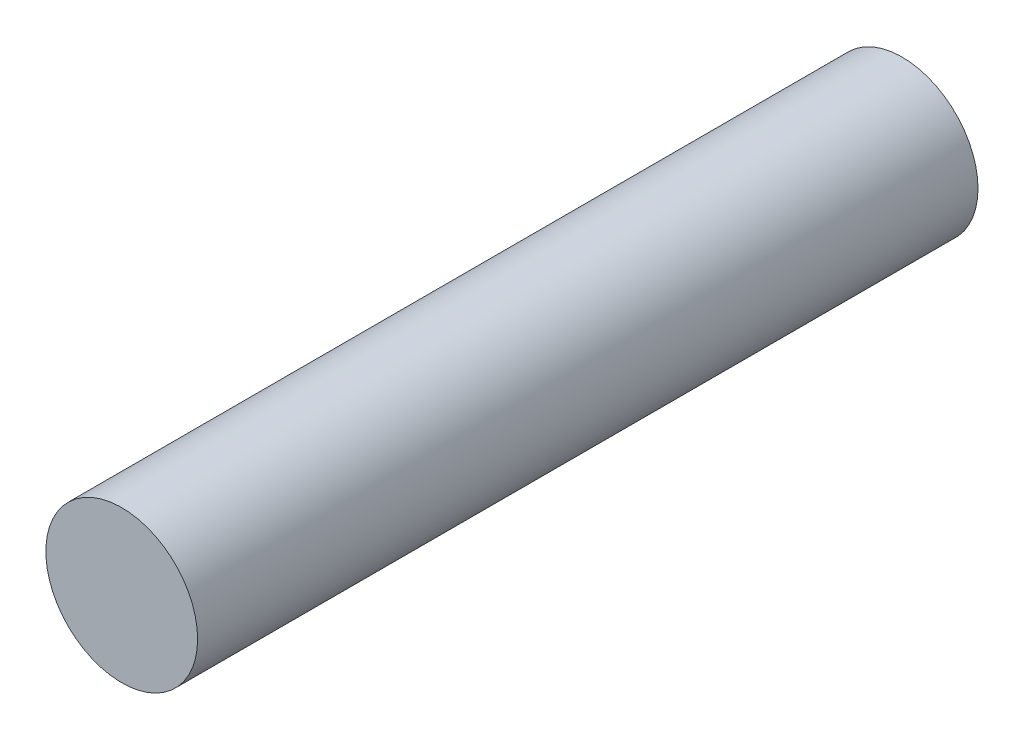
ISO-10303-21;
HEADER;
FILE_DESCRIPTION(('STEP AP214'),'2;1');
FILE_NAME('part.step','',(''),(''),'','','');
FILE_SCHEMA(('AUTOMOTIVE_DESIGN { 1 0 10303 214 1 1 1 1 }'));
ENDSEC;
DATA;
#1=APPLICATION_CONTEXT('core data for automotive mechanical design processes');
#2=APPLICATION_PROTOCOL_DEFINITION('international standard','automotive_design',2000,#1);
#3=PRODUCT_CONTEXT('',#1,'mechanical');
#4=PRODUCT('Part','Part','',(#3));
#5=PRODUCT_RELATED_PRODUCT_CATEGORY('part','',(#4));
#6=PRODUCT_DEFINITION_FORMATION('','',#4);
#7=PRODUCT_DEFINITION_CONTEXT('part definition',#1,'design');
#8=PRODUCT_DEFINITION('design','',#6,#7);
#9=PRODUCT_DEFINITION_SHAPE('','',#8);
#10=(LENGTH_UNIT() NAMED_UNIT(*) SI_UNIT(.MILLI.,.METRE.));
#11=(NAMED_UNIT(*) PLANE_ANGLE_UNIT() SI_UNIT($,.RADIAN.));
#12=(NAMED_UNIT(*) SI_UNIT($,.STERADIAN.) SOLID_ANGLE_UNIT());
#13=UNCERTAINTY_MEASURE_WITH_UNIT(LENGTH_MEASURE(1.E-05),#10,'distance_accuracy_value','');
#14=(GEOMETRIC_REPRESENTATION_CONTEXT(3) GLOBAL_UNCERTAINTY_ASSIGNED_CONTEXT((#13)) GLOBAL_UNIT_ASSIGNED_CONTEXT((#10,
#11,#12)) REPRESENTATION_CONTEXT('',''));
#15=CARTESIAN_POINT('',(0.,0.,0.));
#16=DIRECTION('',(0.,0.,1.));
#17=DIRECTION('',(1.,0.,0.));
#18=AXIS2_PLACEMENT_3D('',#15,#16,#17);
#19=CARTESIAN_POINT('',(0.,0.,18.));
#20=DIRECTION('',(0.,0.,-1.));
#21=DIRECTION('',(-1.,0.,0.));
#22=AXIS2_PLACEMENT_3D('',#19,#20,#21);
#23=CYLINDRICAL_SURFACE('',#22,3.5);
#24=CARTESIAN_POINT('',(0.,0.,18.));
#25=DIRECTION('',(0.,0.,1.));
#26=DIRECTION('',(1.,0.,0.));
#27=AXIS2_PLACEMENT_3D('',#24,#25,#26);
#28=CIRCLE('',#27,3.5);
#29=CARTESIAN_POINT('',(3.5,0.,18.));
#30=VERTEX_POINT('',#29);
#31=EDGE_CURVE('E10',#30,#30,#28,.T.);
#32=ORIENTED_EDGE('',*,*,#31,.F.);
#33=EDGE_LOOP('',(#32));
#34=FACE_BOUND('',#33,.T.);
#35=CARTESIAN_POINT('',(0.,0.,-18.));
#36=DIRECTION('',(0.,0.,1.));
#37=DIRECTION('',(1.,0.,0.));
#38=AXIS2_PLACEMENT_3D('',#35,#36,#37);
#39=CIRCLE('',#38,3.5);
#40=CARTESIAN_POINT('',(3.5,0.,-18.));
#41=VERTEX_POINT('',#40);
#42=EDGE_CURVE('E32',#41,#41,#39,.T.);
#43=ORIENTED_EDGE('',*,*,#42,.T.);
#44=EDGE_LOOP('',(#43));
#45=FACE_BOUND('',#44,.T.);
#46=ADVANCED_FACE('F29',(#34,#45),#23,.T.);
#47=CARTESIAN_POINT('',(0.,0.,18.));
#48=DIRECTION('',(0.,0.,1.));
#49=DIRECTION('',(1.,0.,0.));
#50=AXIS2_PLACEMENT_3D('',#47,#48,#49);
#51=PLANE('',#50);
#52=ORIENTED_EDGE('',*,*,#31,.T.);
#53=EDGE_LOOP('',(#52));
#54=FACE_BOUND('',#53,.T.);
#55=ADVANCED_FACE('F44',(#54),#51,.T.);
#56=CARTESIAN_POINT('',(0.,0.,-18.));
#57=DIRECTION('',(0.,0.,1.));
#58=DIRECTION('',(1.,0.,0.));
#59=AXIS2_PLACEMENT_3D('',#56,#57,#58);
#60=PLANE('',#59);
#61=ORIENTED_EDGE('',*,*,#42,.F.);
#62=EDGE_LOOP('',(#61));
#63=FACE_BOUND('',#62,.T.);
#64=ADVANCED_FACE('F42',(#63),#60,.F.);
#65=CLOSED_SHELL('',(#46,#55,#64));
#66=MANIFOLD_SOLID_BREP('B2',#65);
#67=ADVANCED_BREP_SHAPE_REPRESENTATION('',(#18,#66),#14);
#68=SHAPE_DEFINITION_REPRESENTATION(#9,#67);
ENDSEC;
END-ISO-10303-21;
